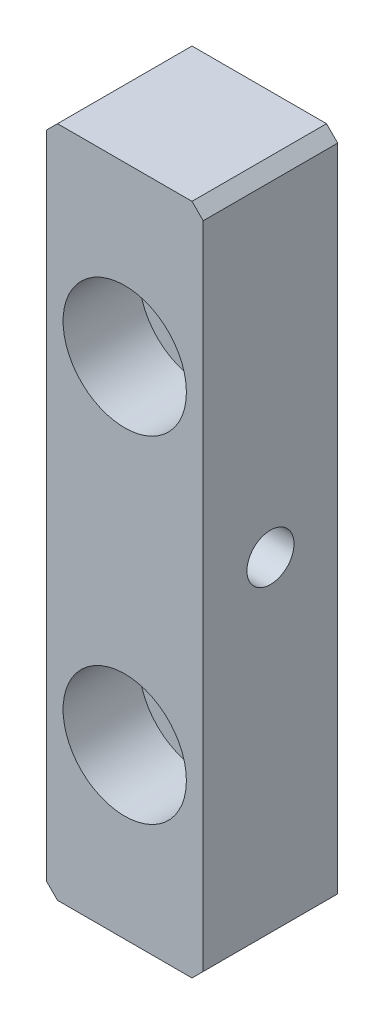
ISO-10303-21;
HEADER;
FILE_DESCRIPTION(('STEP AP214'),'2;1');
FILE_NAME('part.step','',(''),(''),'','','');
FILE_SCHEMA(('AUTOMOTIVE_DESIGN { 1 0 10303 214 1 1 1 1 }'));
ENDSEC;
DATA;
#1=APPLICATION_CONTEXT('core data for automotive mechanical design processes');
#2=APPLICATION_PROTOCOL_DEFINITION('international standard','automotive_design',2000,#1);
#3=PRODUCT_CONTEXT('',#1,'mechanical');
#4=PRODUCT('Part','Part','',(#3));
#5=PRODUCT_RELATED_PRODUCT_CATEGORY('part','',(#4));
#6=PRODUCT_DEFINITION_FORMATION('','',#4);
#7=PRODUCT_DEFINITION_CONTEXT('part definition',#1,'design');
#8=PRODUCT_DEFINITION('design','',#6,#7);
#9=PRODUCT_DEFINITION_SHAPE('','',#8);
#10=(LENGTH_UNIT() NAMED_UNIT(*) SI_UNIT(.MILLI.,.METRE.));
#11=(NAMED_UNIT(*) PLANE_ANGLE_UNIT() SI_UNIT($,.RADIAN.));
#12=(NAMED_UNIT(*) SI_UNIT($,.STERADIAN.) SOLID_ANGLE_UNIT());
#13=UNCERTAINTY_MEASURE_WITH_UNIT(LENGTH_MEASURE(1.E-05),#10,'distance_accuracy_value','');
#14=(GEOMETRIC_REPRESENTATION_CONTEXT(3) GLOBAL_UNCERTAINTY_ASSIGNED_CONTEXT((#13)) GLOBAL_UNIT_ASSIGNED_CONTEXT((#10,
#11,#12)) REPRESENTATION_CONTEXT('',''));
#15=CARTESIAN_POINT('',(0.,0.,0.));
#16=DIRECTION('',(0.,0.,1.));
#17=DIRECTION('',(1.,0.,0.));
#18=AXIS2_PLACEMENT_3D('',#15,#16,#17);
#19=CARTESIAN_POINT('',(7.,-30.,12.));
#20=DIRECTION('',(-1.,0.,0.));
#21=DIRECTION('',(0.,0.,1.));
#22=AXIS2_PLACEMENT_3D('',#19,#20,#21);
#23=PLANE('',#22);
#24=CARTESIAN_POINT('',(7.,0.,6.));
#25=DIRECTION('',(1.,0.,0.));
#26=DIRECTION('',(0.,0.,-1.));
#27=AXIS2_PLACEMENT_3D('',#24,#25,#26);
#28=CIRCLE('',#27,2.1);
#29=CARTESIAN_POINT('',(7.,0.,3.9));
#30=VERTEX_POINT('',#29);
#31=EDGE_CURVE('E250',#30,#30,#28,.T.);
#32=ORIENTED_EDGE('',*,*,#31,.F.);
#33=EDGE_LOOP('',(#32));
#34=FACE_BOUND('',#33,.T.);
#35=DIRECTION('',(0.,1.,0.));
#36=VECTOR('',#35,1.);
#37=CARTESIAN_POINT('',(7.,-30.,12.));
#38=LINE('',#37,#36);
#39=CARTESIAN_POINT('',(7.,-29.,12.));
#40=VERTEX_POINT('',#39);
#41=CARTESIAN_POINT('',(7.,29.,12.));
#42=VERTEX_POINT('',#41);
#43=EDGE_CURVE('E136',#40,#42,#38,.T.);
#44=ORIENTED_EDGE('',*,*,#43,.F.);
#45=DIRECTION('',(0.,0.,-1.));
#46=VECTOR('',#45,1.);
#47=CARTESIAN_POINT('',(7.,-29.,12.));
#48=LINE('',#47,#46);
#49=CARTESIAN_POINT('',(7.,-29.,0.));
#50=VERTEX_POINT('',#49);
#51=EDGE_CURVE('E120',#40,#50,#48,.T.);
#52=ORIENTED_EDGE('',*,*,#51,.T.);
#53=DIRECTION('',(0.,1.,0.));
#54=VECTOR('',#53,1.);
#55=CARTESIAN_POINT('',(7.,-30.,0.));
#56=LINE('',#55,#54);
#57=CARTESIAN_POINT('',(7.,29.,0.));
#58=VERTEX_POINT('',#57);
#59=EDGE_CURVE('E133',#50,#58,#56,.T.);
#60=ORIENTED_EDGE('',*,*,#59,.T.);
#61=DIRECTION('',(0.,0.,1.));
#62=VECTOR('',#61,1.);
#63=CARTESIAN_POINT('',(7.,29.,12.));
#64=LINE('',#63,#62);
#65=EDGE_CURVE('E139',#58,#42,#64,.T.);
#66=ORIENTED_EDGE('',*,*,#65,.T.);
#67=EDGE_LOOP('',(#44,#52,#60,#66));
#68=FACE_BOUND('',#67,.T.);
#69=ADVANCED_FACE('F48',(#34,#68),#23,.F.);
#70=CARTESIAN_POINT('',(-7.,30.,12.));
#71=DIRECTION('',(0.,-1.,0.));
#72=DIRECTION('',(0.,0.,-1.));
#73=AXIS2_PLACEMENT_3D('',#70,#71,#72);
#74=PLANE('',#73);
#75=DIRECTION('',(-1.,0.,0.));
#76=VECTOR('',#75,1.);
#77=CARTESIAN_POINT('',(-7.,30.,0.));
#78=LINE('',#77,#76);
#79=CARTESIAN_POINT('',(6.00000000000001,30.,0.));
#80=VERTEX_POINT('',#79);
#81=CARTESIAN_POINT('',(-6.,30.,0.));
#82=VERTEX_POINT('',#81);
#83=EDGE_CURVE('E144',#80,#82,#78,.T.);
#84=ORIENTED_EDGE('',*,*,#83,.T.);
#85=DIRECTION('',(0.,0.,1.));
#86=VECTOR('',#85,1.);
#87=CARTESIAN_POINT('',(-6.,30.,12.));
#88=LINE('',#87,#86);
#89=CARTESIAN_POINT('',(-6.,30.,12.));
#90=VERTEX_POINT('',#89);
#91=EDGE_CURVE('E11',#82,#90,#88,.T.);
#92=ORIENTED_EDGE('',*,*,#91,.T.);
#93=DIRECTION('',(-1.,0.,0.));
#94=VECTOR('',#93,1.);
#95=CARTESIAN_POINT('',(-7.,30.,12.));
#96=LINE('',#95,#94);
#97=CARTESIAN_POINT('',(6.00000000000001,30.,12.));
#98=VERTEX_POINT('',#97);
#99=EDGE_CURVE('E201',#98,#90,#96,.T.);
#100=ORIENTED_EDGE('',*,*,#99,.F.);
#101=DIRECTION('',(0.,0.,-1.));
#102=VECTOR('',#101,1.);
#103=CARTESIAN_POINT('',(6.00000000000001,30.,12.));
#104=LINE('',#103,#102);
#105=EDGE_CURVE('E58',#98,#80,#104,.T.);
#106=ORIENTED_EDGE('',*,*,#105,.T.);
#107=EDGE_LOOP('',(#84,#92,#100,#106));
#108=FACE_BOUND('',#107,.T.);
#109=ADVANCED_FACE('F199',(#108),#74,.F.);
#110=CARTESIAN_POINT('',(-7.,-30.,12.));
#111=DIRECTION('',(1.,0.,0.));
#112=DIRECTION('',(0.,0.,-1.));
#113=AXIS2_PLACEMENT_3D('',#110,#111,#112);
#114=PLANE('',#113);
#115=CARTESIAN_POINT('',(-7.,0.,6.));
#116=DIRECTION('',(1.,0.,0.));
#117=DIRECTION('',(0.,0.,-1.));
#118=AXIS2_PLACEMENT_3D('',#115,#116,#117);
#119=CIRCLE('',#118,2.1);
#120=CARTESIAN_POINT('',(-7.,0.,3.9));
#121=VERTEX_POINT('',#120);
#122=EDGE_CURVE('E246',#121,#121,#119,.T.);
#123=ORIENTED_EDGE('',*,*,#122,.T.);
#124=EDGE_LOOP('',(#123));
#125=FACE_BOUND('',#124,.T.);
#126=DIRECTION('',(0.,-1.,0.));
#127=VECTOR('',#126,1.);
#128=CARTESIAN_POINT('',(-7.,-30.,0.));
#129=LINE('',#128,#127);
#130=CARTESIAN_POINT('',(-7.,29.,0.));
#131=VERTEX_POINT('',#130);
#132=CARTESIAN_POINT('',(-7.,-29.,0.));
#133=VERTEX_POINT('',#132);
#134=EDGE_CURVE('E150',#131,#133,#129,.T.);
#135=ORIENTED_EDGE('',*,*,#134,.T.);
#136=DIRECTION('',(0.,0.,1.));
#137=VECTOR('',#136,1.);
#138=CARTESIAN_POINT('',(-7.,-29.,12.));
#139=LINE('',#138,#137);
#140=CARTESIAN_POINT('',(-7.,-29.,12.));
#141=VERTEX_POINT('',#140);
#142=EDGE_CURVE('E65',#133,#141,#139,.T.);
#143=ORIENTED_EDGE('',*,*,#142,.T.);
#144=DIRECTION('',(0.,-1.,0.));
#145=VECTOR('',#144,1.);
#146=CARTESIAN_POINT('',(-7.,-30.,12.));
#147=LINE('',#146,#145);
#148=CARTESIAN_POINT('',(-7.,29.,12.));
#149=VERTEX_POINT('',#148);
#150=EDGE_CURVE('E209',#149,#141,#147,.T.);
#151=ORIENTED_EDGE('',*,*,#150,.F.);
#152=DIRECTION('',(0.,0.,-1.));
#153=VECTOR('',#152,1.);
#154=CARTESIAN_POINT('',(-7.,29.,12.));
#155=LINE('',#154,#153);
#156=EDGE_CURVE('E189',#149,#131,#155,.T.);
#157=ORIENTED_EDGE('',*,*,#156,.T.);
#158=EDGE_LOOP('',(#135,#143,#151,#157));
#159=FACE_BOUND('',#158,.T.);
#160=ADVANCED_FACE('F208',(#125,#159),#114,.F.);
#161=CARTESIAN_POINT('',(-7.,-30.,12.));
#162=DIRECTION('',(0.,1.,0.));
#163=DIRECTION('',(0.,0.,1.));
#164=AXIS2_PLACEMENT_3D('',#161,#162,#163);
#165=PLANE('',#164);
#166=DIRECTION('',(1.,0.,0.));
#167=VECTOR('',#166,1.);
#168=CARTESIAN_POINT('',(-7.,-30.,0.));
#169=LINE('',#168,#167);
#170=CARTESIAN_POINT('',(-6.,-30.,0.));
#171=VERTEX_POINT('',#170);
#172=CARTESIAN_POINT('',(6.,-30.,0.));
#173=VERTEX_POINT('',#172);
#174=EDGE_CURVE('E161',#171,#173,#169,.T.);
#175=ORIENTED_EDGE('',*,*,#174,.T.);
#176=DIRECTION('',(0.,0.,1.));
#177=VECTOR('',#176,1.);
#178=CARTESIAN_POINT('',(6.,-30.,12.));
#179=LINE('',#178,#177);
#180=CARTESIAN_POINT('',(6.,-30.,12.));
#181=VERTEX_POINT('',#180);
#182=EDGE_CURVE('E121',#173,#181,#179,.T.);
#183=ORIENTED_EDGE('',*,*,#182,.T.);
#184=DIRECTION('',(1.,0.,0.));
#185=VECTOR('',#184,1.);
#186=CARTESIAN_POINT('',(-7.,-30.,12.));
#187=LINE('',#186,#185);
#188=CARTESIAN_POINT('',(-6.,-30.,12.));
#189=VERTEX_POINT('',#188);
#190=EDGE_CURVE('E156',#189,#181,#187,.T.);
#191=ORIENTED_EDGE('',*,*,#190,.F.);
#192=DIRECTION('',(0.,0.,-1.));
#193=VECTOR('',#192,1.);
#194=CARTESIAN_POINT('',(-6.,-30.,12.));
#195=LINE('',#194,#193);
#196=EDGE_CURVE('E127',#189,#171,#195,.T.);
#197=ORIENTED_EDGE('',*,*,#196,.T.);
#198=EDGE_LOOP('',(#175,#183,#191,#197));
#199=FACE_BOUND('',#198,.T.);
#200=ADVANCED_FACE('F294',(#199),#165,.F.);
#201=CARTESIAN_POINT('',(0.,0.,12.));
#202=DIRECTION('',(0.,0.,-1.));
#203=DIRECTION('',(-1.,0.,0.));
#204=AXIS2_PLACEMENT_3D('',#201,#202,#203);
#205=PLANE('',#204);
#206=CARTESIAN_POINT('',(0.,-15.,12.));
#207=DIRECTION('',(0.,0.,1.));
#208=DIRECTION('',(1.,0.,0.));
#209=AXIS2_PLACEMENT_3D('',#206,#207,#208);
#210=CIRCLE('',#209,5.5);
#211=CARTESIAN_POINT('',(5.5,-15.,12.));
#212=VERTEX_POINT('',#211);
#213=EDGE_CURVE('E242',#212,#212,#210,.T.);
#214=ORIENTED_EDGE('',*,*,#213,.F.);
#215=EDGE_LOOP('',(#214));
#216=FACE_BOUND('',#215,.T.);
#217=CARTESIAN_POINT('',(0.,15.,12.));
#218=DIRECTION('',(0.,0.,1.));
#219=DIRECTION('',(1.,0.,0.));
#220=AXIS2_PLACEMENT_3D('',#217,#218,#219);
#221=CIRCLE('',#220,5.5);
#222=CARTESIAN_POINT('',(5.5,15.,12.));
#223=VERTEX_POINT('',#222);
#224=EDGE_CURVE('E226',#223,#223,#221,.T.);
#225=ORIENTED_EDGE('',*,*,#224,.F.);
#226=EDGE_LOOP('',(#225));
#227=FACE_BOUND('',#226,.T.);
#228=ORIENTED_EDGE('',*,*,#190,.T.);
#229=DIRECTION('',(-0.70710678118655,-0.707106781186545,0.));
#230=VECTOR('',#229,1.);
#231=CARTESIAN_POINT('',(7.,-29.,12.));
#232=LINE('',#231,#230);
#233=EDGE_CURVE('E186',#181,#40,#232,.F.);
#234=ORIENTED_EDGE('',*,*,#233,.T.);
#235=ORIENTED_EDGE('',*,*,#43,.T.);
#236=DIRECTION('',(0.707106781186545,-0.70710678118655,0.));
#237=VECTOR('',#236,1.);
#238=CARTESIAN_POINT('',(6.00000000000001,30.,12.));
#239=LINE('',#238,#237);
#240=EDGE_CURVE('E178',#42,#98,#239,.F.);
#241=ORIENTED_EDGE('',*,*,#240,.T.);
#242=ORIENTED_EDGE('',*,*,#99,.T.);
#243=DIRECTION('',(0.70710678118655,0.707106781186545,0.));
#244=VECTOR('',#243,1.);
#245=CARTESIAN_POINT('',(-7.,29.,12.));
#246=LINE('',#245,#244);
#247=EDGE_CURVE('E72',#90,#149,#246,.F.);
#248=ORIENTED_EDGE('',*,*,#247,.T.);
#249=ORIENTED_EDGE('',*,*,#150,.T.);
#250=DIRECTION('',(-0.707106781186545,0.70710678118655,0.));
#251=VECTOR('',#250,1.);
#252=CARTESIAN_POINT('',(-6.,-30.,12.));
#253=LINE('',#252,#251);
#254=EDGE_CURVE('E183',#141,#189,#253,.F.);
#255=ORIENTED_EDGE('',*,*,#254,.T.);
#256=EDGE_LOOP('',(#228,#234,#235,#241,#242,#248,#249,#255));
#257=FACE_BOUND('',#256,.T.);
#258=ADVANCED_FACE('F290',(#216,#227,#257),#205,.F.);
#259=CARTESIAN_POINT('',(0.,0.,0.));
#260=DIRECTION('',(0.,0.,-1.));
#261=DIRECTION('',(-1.,0.,0.));
#262=AXIS2_PLACEMENT_3D('',#259,#260,#261);
#263=PLANE('',#262);
#264=CARTESIAN_POINT('',(0.,-15.,0.));
#265=DIRECTION('',(0.,0.,1.));
#266=DIRECTION('',(1.,0.,0.));
#267=AXIS2_PLACEMENT_3D('',#264,#265,#266);
#268=CIRCLE('',#267,3.3);
#269=CARTESIAN_POINT('',(3.3,-15.,0.));
#270=VERTEX_POINT('',#269);
#271=EDGE_CURVE('E230',#270,#270,#268,.T.);
#272=ORIENTED_EDGE('',*,*,#271,.T.);
#273=EDGE_LOOP('',(#272));
#274=FACE_BOUND('',#273,.T.);
#275=CARTESIAN_POINT('',(0.,15.,0.));
#276=DIRECTION('',(0.,0.,1.));
#277=DIRECTION('',(1.,0.,0.));
#278=AXIS2_PLACEMENT_3D('',#275,#276,#277);
#279=CIRCLE('',#278,3.3);
#280=CARTESIAN_POINT('',(3.3,15.,0.));
#281=VERTEX_POINT('',#280);
#282=EDGE_CURVE('E145',#281,#281,#279,.T.);
#283=ORIENTED_EDGE('',*,*,#282,.T.);
#284=EDGE_LOOP('',(#283));
#285=FACE_BOUND('',#284,.T.);
#286=ORIENTED_EDGE('',*,*,#59,.F.);
#287=DIRECTION('',(0.70710678118655,0.707106781186545,0.));
#288=VECTOR('',#287,1.);
#289=CARTESIAN_POINT('',(18.,-18.0000000000001,0.));
#290=LINE('',#289,#288);
#291=EDGE_CURVE('E116',#50,#173,#290,.F.);
#292=ORIENTED_EDGE('',*,*,#291,.T.);
#293=ORIENTED_EDGE('',*,*,#174,.F.);
#294=DIRECTION('',(0.707106781186545,-0.70710678118655,0.));
#295=VECTOR('',#294,1.);
#296=CARTESIAN_POINT('',(-18.,-17.9999999999999,0.));
#297=LINE('',#296,#295);
#298=EDGE_CURVE('E128',#171,#133,#297,.F.);
#299=ORIENTED_EDGE('',*,*,#298,.T.);
#300=ORIENTED_EDGE('',*,*,#134,.F.);
#301=DIRECTION('',(-0.70710678118655,-0.707106781186545,0.));
#302=VECTOR('',#301,1.);
#303=CARTESIAN_POINT('',(-18.,18.0000000000001,0.));
#304=LINE('',#303,#302);
#305=EDGE_CURVE('E168',#131,#82,#304,.F.);
#306=ORIENTED_EDGE('',*,*,#305,.T.);
#307=ORIENTED_EDGE('',*,*,#83,.F.);
#308=DIRECTION('',(-0.707106781186545,0.70710678118655,0.));
#309=VECTOR('',#308,1.);
#310=CARTESIAN_POINT('',(18.,17.9999999999999,0.));
#311=LINE('',#310,#309);
#312=EDGE_CURVE('E138',#80,#58,#311,.F.);
#313=ORIENTED_EDGE('',*,*,#312,.T.);
#314=EDGE_LOOP('',(#286,#292,#293,#299,#300,#306,#307,#313));
#315=FACE_BOUND('',#314,.T.);
#316=ADVANCED_FACE('F141',(#274,#285,#315),#263,.T.);
#317=CARTESIAN_POINT('',(0.,15.,12.));
#318=DIRECTION('',(0.,0.,1.));
#319=DIRECTION('',(1.,0.,0.));
#320=AXIS2_PLACEMENT_3D('',#317,#318,#319);
#321=CYLINDRICAL_SURFACE('',#320,3.3);
#322=ORIENTED_EDGE('',*,*,#282,.F.);
#323=EDGE_LOOP('',(#322));
#324=FACE_BOUND('',#323,.T.);
#325=CARTESIAN_POINT('',(0.,15.,5.2));
#326=DIRECTION('',(0.,0.,1.));
#327=DIRECTION('',(1.,0.,0.));
#328=AXIS2_PLACEMENT_3D('',#325,#326,#327);
#329=CIRCLE('',#328,3.3);
#330=CARTESIAN_POINT('',(3.3,15.,5.2));
#331=VERTEX_POINT('',#330);
#332=EDGE_CURVE('E153',#331,#331,#329,.T.);
#333=ORIENTED_EDGE('',*,*,#332,.T.);
#334=EDGE_LOOP('',(#333));
#335=FACE_BOUND('',#334,.T.);
#336=ADVANCED_FACE('F305',(#324,#335),#321,.F.);
#337=CARTESIAN_POINT('',(3.3,15.,5.2));
#338=DIRECTION('',(0.,0.,-1.));
#339=DIRECTION('',(-1.,0.,0.));
#340=AXIS2_PLACEMENT_3D('',#337,#338,#339);
#341=PLANE('',#340);
#342=ORIENTED_EDGE('',*,*,#332,.F.);
#343=EDGE_LOOP('',(#342));
#344=FACE_BOUND('',#343,.T.);
#345=CARTESIAN_POINT('',(0.,15.,5.2));
#346=DIRECTION('',(0.,0.,1.));
#347=DIRECTION('',(1.,0.,0.));
#348=AXIS2_PLACEMENT_3D('',#345,#346,#347);
#349=CIRCLE('',#348,5.5);
#350=CARTESIAN_POINT('',(5.5,15.,5.2));
#351=VERTEX_POINT('',#350);
#352=EDGE_CURVE('E222',#351,#351,#349,.T.);
#353=ORIENTED_EDGE('',*,*,#352,.T.);
#354=EDGE_LOOP('',(#353));
#355=FACE_BOUND('',#354,.T.);
#356=ADVANCED_FACE('F310',(#344,#355),#341,.F.);
#357=CARTESIAN_POINT('',(0.,15.,12.));
#358=DIRECTION('',(0.,0.,1.));
#359=DIRECTION('',(1.,0.,0.));
#360=AXIS2_PLACEMENT_3D('',#357,#358,#359);
#361=CYLINDRICAL_SURFACE('',#360,5.5);
#362=ORIENTED_EDGE('',*,*,#352,.F.);
#363=EDGE_LOOP('',(#362));
#364=FACE_BOUND('',#363,.T.);
#365=ORIENTED_EDGE('',*,*,#224,.T.);
#366=EDGE_LOOP('',(#365));
#367=FACE_BOUND('',#366,.T.);
#368=ADVANCED_FACE('F314',(#364,#367),#361,.F.);
#369=CARTESIAN_POINT('',(0.,-15.,12.));
#370=DIRECTION('',(0.,0.,1.));
#371=DIRECTION('',(1.,0.,0.));
#372=AXIS2_PLACEMENT_3D('',#369,#370,#371);
#373=CYLINDRICAL_SURFACE('',#372,3.3);
#374=ORIENTED_EDGE('',*,*,#271,.F.);
#375=EDGE_LOOP('',(#374));
#376=FACE_BOUND('',#375,.T.);
#377=CARTESIAN_POINT('',(0.,-15.,5.2));
#378=DIRECTION('',(0.,0.,1.));
#379=DIRECTION('',(1.,0.,0.));
#380=AXIS2_PLACEMENT_3D('',#377,#378,#379);
#381=CIRCLE('',#380,3.3);
#382=CARTESIAN_POINT('',(3.3,-15.,5.2));
#383=VERTEX_POINT('',#382);
#384=EDGE_CURVE('E234',#383,#383,#381,.T.);
#385=ORIENTED_EDGE('',*,*,#384,.T.);
#386=EDGE_LOOP('',(#385));
#387=FACE_BOUND('',#386,.T.);
#388=ADVANCED_FACE('F318',(#376,#387),#373,.F.);
#389=CARTESIAN_POINT('',(3.3,-15.,5.2));
#390=DIRECTION('',(0.,0.,-1.));
#391=DIRECTION('',(-1.,0.,0.));
#392=AXIS2_PLACEMENT_3D('',#389,#390,#391);
#393=PLANE('',#392);
#394=ORIENTED_EDGE('',*,*,#384,.F.);
#395=EDGE_LOOP('',(#394));
#396=FACE_BOUND('',#395,.T.);
#397=CARTESIAN_POINT('',(0.,-15.,5.2));
#398=DIRECTION('',(0.,0.,1.));
#399=DIRECTION('',(1.,0.,0.));
#400=AXIS2_PLACEMENT_3D('',#397,#398,#399);
#401=CIRCLE('',#400,5.5);
#402=CARTESIAN_POINT('',(5.5,-15.,5.2));
#403=VERTEX_POINT('',#402);
#404=EDGE_CURVE('E238',#403,#403,#401,.T.);
#405=ORIENTED_EDGE('',*,*,#404,.T.);
#406=EDGE_LOOP('',(#405));
#407=FACE_BOUND('',#406,.T.);
#408=ADVANCED_FACE('F322',(#396,#407),#393,.F.);
#409=CARTESIAN_POINT('',(0.,-15.,12.));
#410=DIRECTION('',(0.,0.,1.));
#411=DIRECTION('',(1.,0.,0.));
#412=AXIS2_PLACEMENT_3D('',#409,#410,#411);
#413=CYLINDRICAL_SURFACE('',#412,5.5);
#414=ORIENTED_EDGE('',*,*,#404,.F.);
#415=EDGE_LOOP('',(#414));
#416=FACE_BOUND('',#415,.T.);
#417=ORIENTED_EDGE('',*,*,#213,.T.);
#418=EDGE_LOOP('',(#417));
#419=FACE_BOUND('',#418,.T.);
#420=ADVANCED_FACE('F274',(#416,#419),#413,.F.);
#421=CARTESIAN_POINT('',(7.,-29.,12.));
#422=DIRECTION('',(-0.707106781186545,0.70710678118655,0.));
#423=DIRECTION('',(0.,0.,-1.));
#424=AXIS2_PLACEMENT_3D('',#421,#422,#423);
#425=PLANE('',#424);
#426=ORIENTED_EDGE('',*,*,#233,.F.);
#427=ORIENTED_EDGE('',*,*,#182,.F.);
#428=ORIENTED_EDGE('',*,*,#291,.F.);
#429=ORIENTED_EDGE('',*,*,#51,.F.);
#430=EDGE_LOOP('',(#426,#427,#428,#429));
#431=FACE_BOUND('',#430,.T.);
#432=ADVANCED_FACE('F119',(#431),#425,.F.);
#433=CARTESIAN_POINT('',(-6.,-30.,12.));
#434=DIRECTION('',(0.70710678118655,0.707106781186545,0.));
#435=DIRECTION('',(0.,0.,-1.));
#436=AXIS2_PLACEMENT_3D('',#433,#434,#435);
#437=PLANE('',#436);
#438=ORIENTED_EDGE('',*,*,#254,.F.);
#439=ORIENTED_EDGE('',*,*,#142,.F.);
#440=ORIENTED_EDGE('',*,*,#298,.F.);
#441=ORIENTED_EDGE('',*,*,#196,.F.);
#442=EDGE_LOOP('',(#438,#439,#440,#441));
#443=FACE_BOUND('',#442,.T.);
#444=ADVANCED_FACE('F273',(#443),#437,.F.);
#445=CARTESIAN_POINT('',(-7.,29.,12.));
#446=DIRECTION('',(0.707106781186545,-0.70710678118655,0.));
#447=DIRECTION('',(0.,0.,-1.));
#448=AXIS2_PLACEMENT_3D('',#445,#446,#447);
#449=PLANE('',#448);
#450=ORIENTED_EDGE('',*,*,#247,.F.);
#451=ORIENTED_EDGE('',*,*,#91,.F.);
#452=ORIENTED_EDGE('',*,*,#305,.F.);
#453=ORIENTED_EDGE('',*,*,#156,.F.);
#454=EDGE_LOOP('',(#450,#451,#452,#453));
#455=FACE_BOUND('',#454,.T.);
#456=ADVANCED_FACE('F207',(#455),#449,.F.);
#457=CARTESIAN_POINT('',(6.00000000000001,30.,12.));
#458=DIRECTION('',(-0.70710678118655,-0.707106781186545,0.));
#459=DIRECTION('',(0.,0.,-1.));
#460=AXIS2_PLACEMENT_3D('',#457,#458,#459);
#461=PLANE('',#460);
#462=ORIENTED_EDGE('',*,*,#240,.F.);
#463=ORIENTED_EDGE('',*,*,#65,.F.);
#464=ORIENTED_EDGE('',*,*,#312,.F.);
#465=ORIENTED_EDGE('',*,*,#105,.F.);
#466=EDGE_LOOP('',(#462,#463,#464,#465));
#467=FACE_BOUND('',#466,.T.);
#468=ADVANCED_FACE('F51',(#467),#461,.F.);
#469=CARTESIAN_POINT('',(7.,0.,6.));
#470=DIRECTION('',(1.,0.,0.));
#471=DIRECTION('',(0.,0.,-1.));
#472=AXIS2_PLACEMENT_3D('',#469,#470,#471);
#473=CYLINDRICAL_SURFACE('',#472,2.1);
#474=ORIENTED_EDGE('',*,*,#122,.F.);
#475=EDGE_LOOP('',(#474));
#476=FACE_BOUND('',#475,.T.);
#477=ORIENTED_EDGE('',*,*,#31,.T.);
#478=EDGE_LOOP('',(#477));
#479=FACE_BOUND('',#478,.T.);
#480=ADVANCED_FACE('F255',(#476,#479),#473,.F.);
#481=CLOSED_SHELL('',(#69,#109,#160,#200,#258,#316,#336,#356,#368,#388,#408,#420,#432,#444,#456,
#468,#480));
#482=MANIFOLD_SOLID_BREP('B2',#481);
#483=ADVANCED_BREP_SHAPE_REPRESENTATION('',(#18,#482),#14);
#484=SHAPE_DEFINITION_REPRESENTATION(#9,#483);
ENDSEC;
END-ISO-10303-21;
